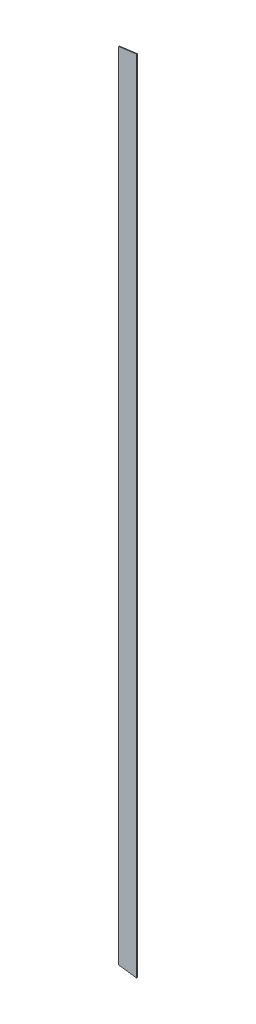
ISO-10303-21;
HEADER;
FILE_DESCRIPTION(('STEP AP214'),'2;1');
FILE_NAME('part.step','',(''),(''),'','','');
FILE_SCHEMA(('AUTOMOTIVE_DESIGN { 1 0 10303 214 1 1 1 1 }'));
ENDSEC;
DATA;
#1=APPLICATION_CONTEXT('core data for automotive mechanical design processes');
#2=APPLICATION_PROTOCOL_DEFINITION('international standard','automotive_design',2000,#1);
#3=PRODUCT_CONTEXT('',#1,'mechanical');
#4=PRODUCT('Part','Part','',(#3));
#5=PRODUCT_RELATED_PRODUCT_CATEGORY('part','',(#4));
#6=PRODUCT_DEFINITION_FORMATION('','',#4);
#7=PRODUCT_DEFINITION_CONTEXT('part definition',#1,'design');
#8=PRODUCT_DEFINITION('design','',#6,#7);
#9=PRODUCT_DEFINITION_SHAPE('','',#8);
#10=(LENGTH_UNIT() NAMED_UNIT(*) SI_UNIT(.MILLI.,.METRE.));
#11=(NAMED_UNIT(*) PLANE_ANGLE_UNIT() SI_UNIT($,.RADIAN.));
#12=(NAMED_UNIT(*) SI_UNIT($,.STERADIAN.) SOLID_ANGLE_UNIT());
#13=UNCERTAINTY_MEASURE_WITH_UNIT(LENGTH_MEASURE(1.E-05),#10,'distance_accuracy_value','');
#14=(GEOMETRIC_REPRESENTATION_CONTEXT(3) GLOBAL_UNCERTAINTY_ASSIGNED_CONTEXT((#13)) GLOBAL_UNIT_ASSIGNED_CONTEXT((#10,
#11,#12)) REPRESENTATION_CONTEXT('',''));
#15=CARTESIAN_POINT('',(0.,0.,0.));
#16=DIRECTION('',(0.,0.,1.));
#17=DIRECTION('',(1.,0.,0.));
#18=AXIS2_PLACEMENT_3D('',#15,#16,#17);
#19=CARTESIAN_POINT('',(24.9999999999999,1150.,1.));
#20=DIRECTION('',(-1.,0.,0.));
#21=DIRECTION('',(0.,-1.,0.));
#22=AXIS2_PLACEMENT_3D('',#19,#20,#21);
#23=PLANE('',#22);
#24=DIRECTION('',(0.,0.,1.));
#25=VECTOR('',#24,1.);
#26=CARTESIAN_POINT('',(24.9999999999999,1120.,-1.));
#27=LINE('',#26,#25);
#28=CARTESIAN_POINT('',(24.9999999999999,1120.,-1.));
#29=VERTEX_POINT('',#28);
#30=CARTESIAN_POINT('',(24.9999999999999,1120.,1.));
#31=VERTEX_POINT('',#30);
#32=EDGE_CURVE('E57',#29,#31,#27,.T.);
#33=ORIENTED_EDGE('',*,*,#32,.T.);
#34=DIRECTION('',(0.,1.,0.));
#35=VECTOR('',#34,1.);
#36=CARTESIAN_POINT('',(24.9999999999999,1150.,1.));
#37=LINE('',#36,#35);
#38=CARTESIAN_POINT('',(25.0000000000001,-1120.,1.));
#39=VERTEX_POINT('',#38);
#40=EDGE_CURVE('E85',#39,#31,#37,.T.);
#41=ORIENTED_EDGE('',*,*,#40,.F.);
#42=DIRECTION('',(0.,0.,1.));
#43=VECTOR('',#42,1.);
#44=CARTESIAN_POINT('',(25.0000000000001,-1120.,-1.));
#45=LINE('',#44,#43);
#46=CARTESIAN_POINT('',(25.0000000000001,-1120.,-1.));
#47=VERTEX_POINT('',#46);
#48=EDGE_CURVE('E74',#47,#39,#45,.T.);
#49=ORIENTED_EDGE('',*,*,#48,.F.);
#50=DIRECTION('',(0.,1.,0.));
#51=VECTOR('',#50,1.);
#52=CARTESIAN_POINT('',(24.9999999999999,1150.,-1.));
#53=LINE('',#52,#51);
#54=EDGE_CURVE('E83',#47,#29,#53,.T.);
#55=ORIENTED_EDGE('',*,*,#54,.T.);
#56=EDGE_LOOP('',(#33,#41,#49,#55));
#57=FACE_BOUND('',#56,.T.);
#58=ADVANCED_FACE('F36',(#57),#23,.F.);
#59=CARTESIAN_POINT('',(-25.0000000000001,1150.,1.));
#60=DIRECTION('',(1.,0.,0.));
#61=DIRECTION('',(0.,1.,0.));
#62=AXIS2_PLACEMENT_3D('',#59,#60,#61);
#63=PLANE('',#62);
#64=DIRECTION('',(0.,0.,1.));
#65=VECTOR('',#64,1.);
#66=CARTESIAN_POINT('',(-25.0000000000001,1113.5775862069,1.));
#67=LINE('',#66,#65);
#68=CARTESIAN_POINT('',(-25.0000000000002,1113.5775862069,-1.));
#69=VERTEX_POINT('',#68);
#70=CARTESIAN_POINT('',(-25.0000000000002,1113.5775862069,1.));
#71=VERTEX_POINT('',#70);
#72=EDGE_CURVE('E90',#69,#71,#67,.T.);
#73=ORIENTED_EDGE('',*,*,#72,.F.);
#74=DIRECTION('',(0.,-1.,0.));
#75=VECTOR('',#74,1.);
#76=CARTESIAN_POINT('',(-25.0000000000001,1150.,-1.));
#77=LINE('',#76,#75);
#78=CARTESIAN_POINT('',(-24.9999999999999,-1113.5775862069,-1.));
#79=VERTEX_POINT('',#78);
#80=EDGE_CURVE('E89',#69,#79,#77,.T.);
#81=ORIENTED_EDGE('',*,*,#80,.T.);
#82=DIRECTION('',(0.,0.,-1.));
#83=VECTOR('',#82,1.);
#84=CARTESIAN_POINT('',(-24.9999999999999,-1113.5775862069,1.));
#85=LINE('',#84,#83);
#86=CARTESIAN_POINT('',(-25.0000000000002,-1113.5775862069,1.));
#87=VERTEX_POINT('',#86);
#88=EDGE_CURVE('E49',#87,#79,#85,.T.);
#89=ORIENTED_EDGE('',*,*,#88,.F.);
#90=DIRECTION('',(0.,-1.,0.));
#91=VECTOR('',#90,1.);
#92=CARTESIAN_POINT('',(-25.0000000000001,1150.,1.));
#93=LINE('',#92,#91);
#94=EDGE_CURVE('E43',#71,#87,#93,.T.);
#95=ORIENTED_EDGE('',*,*,#94,.F.);
#96=EDGE_LOOP('',(#73,#81,#89,#95));
#97=FACE_BOUND('',#96,.T.);
#98=ADVANCED_FACE('F108',(#97),#63,.F.);
#99=CARTESIAN_POINT('',(0.,0.,1.));
#100=DIRECTION('',(0.,0.,1.));
#101=DIRECTION('',(1.,0.,0.));
#102=AXIS2_PLACEMENT_3D('',#99,#100,#101);
#103=PLANE('',#102);
#104=ORIENTED_EDGE('',*,*,#40,.T.);
#105=DIRECTION('',(-0.991851217531315,-0.127401578803592,0.));
#106=VECTOR('',#105,1.);
#107=CARTESIAN_POINT('',(24.9999999999999,1120.,1.));
#108=LINE('',#107,#106);
#109=EDGE_CURVE('E101',#31,#71,#108,.T.);
#110=ORIENTED_EDGE('',*,*,#109,.T.);
#111=ORIENTED_EDGE('',*,*,#94,.T.);
#112=DIRECTION('',(0.991851217531315,-0.127401578803591,0.));
#113=VECTOR('',#112,1.);
#114=CARTESIAN_POINT('',(-555.,-1045.5,1.));
#115=LINE('',#114,#113);
#116=EDGE_CURVE('E99',#87,#39,#115,.T.);
#117=ORIENTED_EDGE('',*,*,#116,.T.);
#118=EDGE_LOOP('',(#104,#110,#111,#117));
#119=FACE_BOUND('',#118,.T.);
#120=ADVANCED_FACE('F110',(#119),#103,.T.);
#121=CARTESIAN_POINT('',(0.,0.,-1.));
#122=DIRECTION('',(0.,0.,1.));
#123=DIRECTION('',(1.,0.,0.));
#124=AXIS2_PLACEMENT_3D('',#121,#122,#123);
#125=PLANE('',#124);
#126=DIRECTION('',(-0.991851217531315,-0.127401578803592,0.));
#127=VECTOR('',#126,1.);
#128=CARTESIAN_POINT('',(24.9999999999999,1120.,-1.));
#129=LINE('',#128,#127);
#130=EDGE_CURVE('E86',#29,#69,#129,.T.);
#131=ORIENTED_EDGE('',*,*,#130,.F.);
#132=ORIENTED_EDGE('',*,*,#54,.F.);
#133=DIRECTION('',(0.991851217531315,-0.127401578803591,0.));
#134=VECTOR('',#133,1.);
#135=CARTESIAN_POINT('',(-141.121241320922,-1098.66201296826,-1.));
#136=LINE('',#135,#134);
#137=EDGE_CURVE('E12',#79,#47,#136,.T.);
#138=ORIENTED_EDGE('',*,*,#137,.F.);
#139=ORIENTED_EDGE('',*,*,#80,.F.);
#140=EDGE_LOOP('',(#131,#132,#138,#139));
#141=FACE_BOUND('',#140,.T.);
#142=ADVANCED_FACE('F88',(#141),#125,.F.);
#143=CARTESIAN_POINT('',(-555.,-1045.5,-1.));
#144=DIRECTION('',(-0.127401578803591,-0.991851217531315,0.));
#145=DIRECTION('',(0.991851217531315,-0.127401578803591,0.));
#146=AXIS2_PLACEMENT_3D('',#143,#144,#145);
#147=PLANE('',#146);
#148=ORIENTED_EDGE('',*,*,#88,.T.);
#149=ORIENTED_EDGE('',*,*,#137,.T.);
#150=ORIENTED_EDGE('',*,*,#48,.T.);
#151=ORIENTED_EDGE('',*,*,#116,.F.);
#152=EDGE_LOOP('',(#148,#149,#150,#151));
#153=FACE_BOUND('',#152,.T.);
#154=ADVANCED_FACE('F73',(#153),#147,.T.);
#155=CARTESIAN_POINT('',(24.9999999999999,1120.,-1.));
#156=DIRECTION('',(-0.127401578803592,0.991851217531315,0.));
#157=DIRECTION('',(-0.991851217531315,-0.127401578803592,0.));
#158=AXIS2_PLACEMENT_3D('',#155,#156,#157);
#159=PLANE('',#158);
#160=ORIENTED_EDGE('',*,*,#72,.T.);
#161=ORIENTED_EDGE('',*,*,#109,.F.);
#162=ORIENTED_EDGE('',*,*,#32,.F.);
#163=ORIENTED_EDGE('',*,*,#130,.T.);
#164=EDGE_LOOP('',(#160,#161,#162,#163));
#165=FACE_BOUND('',#164,.T.);
#166=ADVANCED_FACE('F105',(#165),#159,.T.);
#167=CLOSED_SHELL('',(#58,#98,#120,#142,#154,#166));
#168=MANIFOLD_SOLID_BREP('B2',#167);
#169=ADVANCED_BREP_SHAPE_REPRESENTATION('',(#18,#168),#14);
#170=SHAPE_DEFINITION_REPRESENTATION(#9,#169);
ENDSEC;
END-ISO-10303-21;
